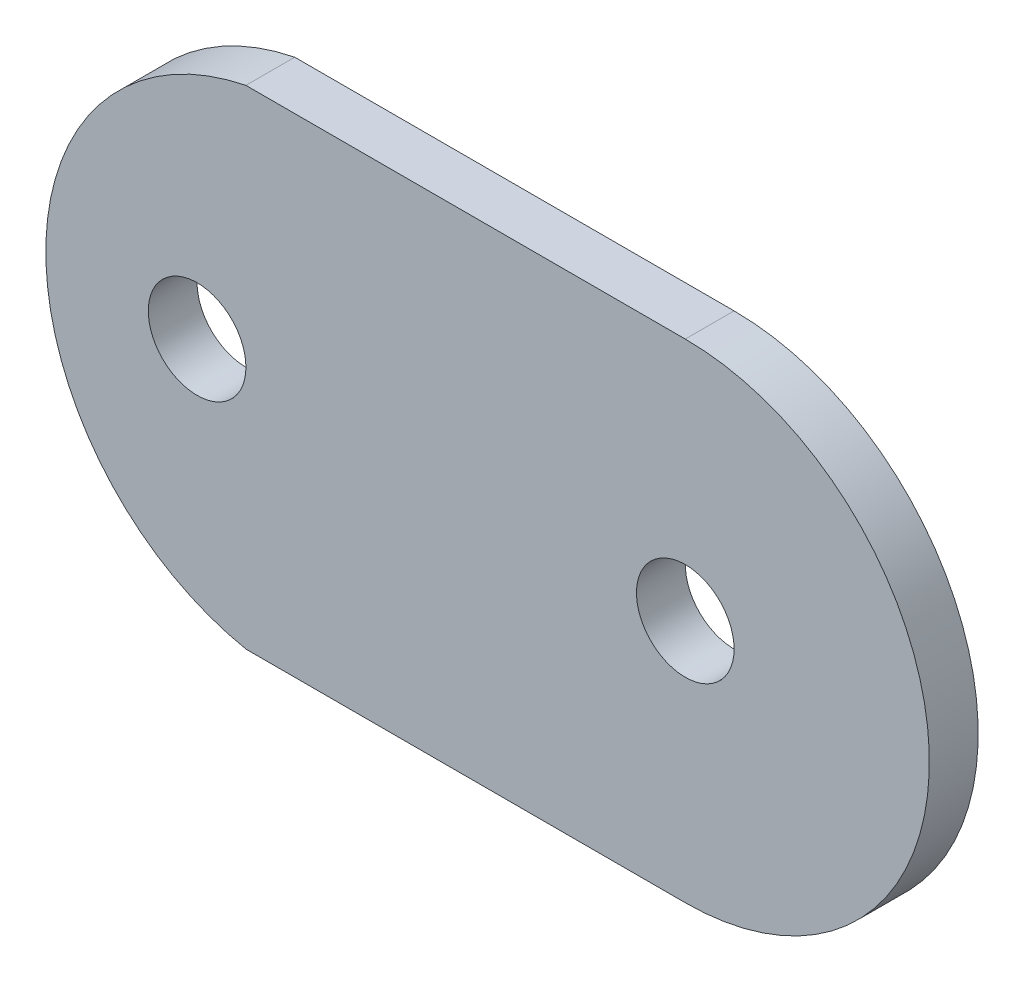
ISO-10303-21;
HEADER;
FILE_DESCRIPTION(('STEP AP214'),'2;1');
FILE_NAME('part.step','',(''),(''),'','','');
FILE_SCHEMA(('AUTOMOTIVE_DESIGN { 1 0 10303 214 1 1 1 1 }'));
ENDSEC;
DATA;
#1=APPLICATION_CONTEXT('core data for automotive mechanical design processes');
#2=APPLICATION_PROTOCOL_DEFINITION('international standard','automotive_design',2000,#1);
#3=PRODUCT_CONTEXT('',#1,'mechanical');
#4=PRODUCT('Part','Part','',(#3));
#5=PRODUCT_RELATED_PRODUCT_CATEGORY('part','',(#4));
#6=PRODUCT_DEFINITION_FORMATION('','',#4);
#7=PRODUCT_DEFINITION_CONTEXT('part definition',#1,'design');
#8=PRODUCT_DEFINITION('design','',#6,#7);
#9=PRODUCT_DEFINITION_SHAPE('','',#8);
#10=(LENGTH_UNIT() NAMED_UNIT(*) SI_UNIT(.MILLI.,.METRE.));
#11=(NAMED_UNIT(*) PLANE_ANGLE_UNIT() SI_UNIT($,.RADIAN.));
#12=(NAMED_UNIT(*) SI_UNIT($,.STERADIAN.) SOLID_ANGLE_UNIT());
#13=UNCERTAINTY_MEASURE_WITH_UNIT(LENGTH_MEASURE(1.E-05),#10,'distance_accuracy_value','');
#14=(GEOMETRIC_REPRESENTATION_CONTEXT(3) GLOBAL_UNCERTAINTY_ASSIGNED_CONTEXT((#13)) GLOBAL_UNIT_ASSIGNED_CONTEXT((#10,
#11,#12)) REPRESENTATION_CONTEXT('',''));
#15=CARTESIAN_POINT('',(0.,0.,0.));
#16=DIRECTION('',(0.,0.,1.));
#17=DIRECTION('',(1.,0.,0.));
#18=AXIS2_PLACEMENT_3D('',#15,#16,#17);
#19=CARTESIAN_POINT('',(5.,5.,1.));
#20=DIRECTION('',(0.,0.,-1.));
#21=DIRECTION('',(-1.,0.,0.));
#22=AXIS2_PLACEMENT_3D('',#19,#20,#21);
#23=PLANE('',#22);
#24=DIRECTION('',(1.,0.,0.));
#25=VECTOR('',#24,1.);
#26=CARTESIAN_POINT('',(-3.,0.,1.));
#27=LINE('',#26,#25);
#28=CARTESIAN_POINT('',(-4.,0.,1.));
#29=VERTEX_POINT('',#28);
#30=CARTESIAN_POINT('',(5.,0.,1.));
#31=VERTEX_POINT('',#30);
#32=EDGE_CURVE('E63',#29,#31,#27,.T.);
#33=ORIENTED_EDGE('',*,*,#32,.T.);
#34=CARTESIAN_POINT('',(5.,5.,1.));
#35=DIRECTION('',(0.,0.,1.));
#36=DIRECTION('',(-1.,0.,0.));
#37=AXIS2_PLACEMENT_3D('',#34,#35,#36);
#38=CIRCLE('',#37,5.);
#39=CARTESIAN_POINT('',(5.,10.,1.));
#40=VERTEX_POINT('',#39);
#41=EDGE_CURVE('E92',#31,#40,#38,.T.);
#42=ORIENTED_EDGE('',*,*,#41,.T.);
#43=DIRECTION('',(-1.,0.,0.));
#44=VECTOR('',#43,1.);
#45=CARTESIAN_POINT('',(0.,10.,1.));
#46=LINE('',#45,#44);
#47=CARTESIAN_POINT('',(-4.,10.,1.));
#48=VERTEX_POINT('',#47);
#49=EDGE_CURVE('E96',#40,#48,#46,.T.);
#50=ORIENTED_EDGE('',*,*,#49,.T.);
#51=CARTESIAN_POINT('',(-3.,5.,1.));
#52=DIRECTION('',(0.,0.,1.));
#53=DIRECTION('',(1.,0.,0.));
#54=AXIS2_PLACEMENT_3D('',#51,#52,#53);
#55=CIRCLE('',#54,5.09901951359279);
#56=EDGE_CURVE('E108',#48,#29,#55,.T.);
#57=ORIENTED_EDGE('',*,*,#56,.T.);
#58=EDGE_LOOP('',(#33,#42,#50,#57));
#59=FACE_BOUND('',#58,.T.);
#60=CARTESIAN_POINT('',(5.,5.,1.));
#61=DIRECTION('',(0.,0.,1.));
#62=DIRECTION('',(1.,0.,0.));
#63=AXIS2_PLACEMENT_3D('',#60,#61,#62);
#64=CIRCLE('',#63,1.);
#65=CARTESIAN_POINT('',(6.,5.,1.));
#66=VERTEX_POINT('',#65);
#67=EDGE_CURVE('E117',#66,#66,#64,.T.);
#68=ORIENTED_EDGE('',*,*,#67,.F.);
#69=EDGE_LOOP('',(#68));
#70=FACE_BOUND('',#69,.T.);
#71=CARTESIAN_POINT('',(-5.,5.,1.));
#72=DIRECTION('',(0.,0.,1.));
#73=DIRECTION('',(1.,0.,0.));
#74=AXIS2_PLACEMENT_3D('',#71,#72,#73);
#75=CIRCLE('',#74,1.);
#76=CARTESIAN_POINT('',(-4.,5.,1.));
#77=VERTEX_POINT('',#76);
#78=EDGE_CURVE('E160',#77,#77,#75,.T.);
#79=ORIENTED_EDGE('',*,*,#78,.F.);
#80=EDGE_LOOP('',(#79));
#81=FACE_BOUND('',#80,.T.);
#82=ADVANCED_FACE('F45',(#59,#70,#81),#23,.F.);
#83=CARTESIAN_POINT('',(5.,5.,0.));
#84=DIRECTION('',(0.,0.,-1.));
#85=DIRECTION('',(-1.,0.,0.));
#86=AXIS2_PLACEMENT_3D('',#83,#84,#85);
#87=PLANE('',#86);
#88=CARTESIAN_POINT('',(5.,5.,0.));
#89=DIRECTION('',(0.,0.,1.));
#90=DIRECTION('',(1.,0.,0.));
#91=AXIS2_PLACEMENT_3D('',#88,#89,#90);
#92=CIRCLE('',#91,1.);
#93=CARTESIAN_POINT('',(6.,5.,0.));
#94=VERTEX_POINT('',#93);
#95=EDGE_CURVE('E167',#94,#94,#92,.T.);
#96=ORIENTED_EDGE('',*,*,#95,.T.);
#97=EDGE_LOOP('',(#96));
#98=FACE_BOUND('',#97,.T.);
#99=CARTESIAN_POINT('',(5.,5.,0.));
#100=DIRECTION('',(0.,0.,1.));
#101=DIRECTION('',(-1.,0.,0.));
#102=AXIS2_PLACEMENT_3D('',#99,#100,#101);
#103=CIRCLE('',#102,5.);
#104=CARTESIAN_POINT('',(5.,0.,0.));
#105=VERTEX_POINT('',#104);
#106=CARTESIAN_POINT('',(5.,10.,0.));
#107=VERTEX_POINT('',#106);
#108=EDGE_CURVE('E102',#105,#107,#103,.T.);
#109=ORIENTED_EDGE('',*,*,#108,.F.);
#110=DIRECTION('',(1.,0.,0.));
#111=VECTOR('',#110,1.);
#112=CARTESIAN_POINT('',(-3.,0.,0.));
#113=LINE('',#112,#111);
#114=CARTESIAN_POINT('',(-4.,0.,0.));
#115=VERTEX_POINT('',#114);
#116=EDGE_CURVE('E122',#115,#105,#113,.T.);
#117=ORIENTED_EDGE('',*,*,#116,.F.);
#118=CARTESIAN_POINT('',(-3.,5.,0.));
#119=DIRECTION('',(0.,0.,1.));
#120=DIRECTION('',(1.,0.,0.));
#121=AXIS2_PLACEMENT_3D('',#118,#119,#120);
#122=CIRCLE('',#121,5.09901951359279);
#123=CARTESIAN_POINT('',(-4.,10.,0.));
#124=VERTEX_POINT('',#123);
#125=EDGE_CURVE('E87',#124,#115,#122,.T.);
#126=ORIENTED_EDGE('',*,*,#125,.F.);
#127=DIRECTION('',(-1.,0.,0.));
#128=VECTOR('',#127,1.);
#129=CARTESIAN_POINT('',(-3.,10.,0.));
#130=LINE('',#129,#128);
#131=EDGE_CURVE('E80',#107,#124,#130,.T.);
#132=ORIENTED_EDGE('',*,*,#131,.F.);
#133=EDGE_LOOP('',(#109,#117,#126,#132));
#134=FACE_BOUND('',#133,.T.);
#135=CARTESIAN_POINT('',(-5.,5.,0.));
#136=DIRECTION('',(0.,0.,1.));
#137=DIRECTION('',(1.,0.,0.));
#138=AXIS2_PLACEMENT_3D('',#135,#136,#137);
#139=CIRCLE('',#138,1.);
#140=CARTESIAN_POINT('',(-4.,5.,0.));
#141=VERTEX_POINT('',#140);
#142=EDGE_CURVE('E163',#141,#141,#139,.T.);
#143=ORIENTED_EDGE('',*,*,#142,.T.);
#144=EDGE_LOOP('',(#143));
#145=FACE_BOUND('',#144,.T.);
#146=ADVANCED_FACE('F131',(#98,#134,#145),#87,.T.);
#147=CARTESIAN_POINT('',(5.,5.,1.));
#148=DIRECTION('',(0.,0.,-1.));
#149=DIRECTION('',(-1.,0.,0.));
#150=AXIS2_PLACEMENT_3D('',#147,#148,#149);
#151=CYLINDRICAL_SURFACE('',#150,5.);
#152=ORIENTED_EDGE('',*,*,#108,.T.);
#153=DIRECTION('',(0.,0.,-1.));
#154=VECTOR('',#153,1.);
#155=CARTESIAN_POINT('',(5.,10.,1.));
#156=LINE('',#155,#154);
#157=EDGE_CURVE('E55',#40,#107,#156,.T.);
#158=ORIENTED_EDGE('',*,*,#157,.F.);
#159=ORIENTED_EDGE('',*,*,#41,.F.);
#160=DIRECTION('',(0.,0.,-1.));
#161=VECTOR('',#160,1.);
#162=CARTESIAN_POINT('',(5.,0.,1.));
#163=LINE('',#162,#161);
#164=EDGE_CURVE('E11',#31,#105,#163,.T.);
#165=ORIENTED_EDGE('',*,*,#164,.T.);
#166=EDGE_LOOP('',(#152,#158,#159,#165));
#167=FACE_BOUND('',#166,.T.);
#168=ADVANCED_FACE('F47',(#167),#151,.T.);
#169=CARTESIAN_POINT('',(-3.,10.,1.));
#170=DIRECTION('',(0.,-1.,0.));
#171=DIRECTION('',(0.,0.,-1.));
#172=AXIS2_PLACEMENT_3D('',#169,#170,#171);
#173=PLANE('',#172);
#174=ORIENTED_EDGE('',*,*,#131,.T.);
#175=DIRECTION('',(0.,0.,-1.));
#176=VECTOR('',#175,1.);
#177=CARTESIAN_POINT('',(-4.,10.,1.));
#178=LINE('',#177,#176);
#179=EDGE_CURVE('E104',#48,#124,#178,.T.);
#180=ORIENTED_EDGE('',*,*,#179,.F.);
#181=ORIENTED_EDGE('',*,*,#49,.F.);
#182=ORIENTED_EDGE('',*,*,#157,.T.);
#183=EDGE_LOOP('',(#174,#180,#181,#182));
#184=FACE_BOUND('',#183,.T.);
#185=ADVANCED_FACE('F105',(#184),#173,.F.);
#186=CARTESIAN_POINT('',(-3.,5.,1.));
#187=DIRECTION('',(0.,0.,-1.));
#188=DIRECTION('',(-1.,0.,0.));
#189=AXIS2_PLACEMENT_3D('',#186,#187,#188);
#190=CYLINDRICAL_SURFACE('',#189,5.09901951359279);
#191=ORIENTED_EDGE('',*,*,#125,.T.);
#192=DIRECTION('',(0.,0.,-1.));
#193=VECTOR('',#192,1.);
#194=CARTESIAN_POINT('',(-4.,0.,1.));
#195=LINE('',#194,#193);
#196=EDGE_CURVE('E111',#29,#115,#195,.T.);
#197=ORIENTED_EDGE('',*,*,#196,.F.);
#198=ORIENTED_EDGE('',*,*,#56,.F.);
#199=ORIENTED_EDGE('',*,*,#179,.T.);
#200=EDGE_LOOP('',(#191,#197,#198,#199));
#201=FACE_BOUND('',#200,.T.);
#202=ADVANCED_FACE('F128',(#201),#190,.T.);
#203=CARTESIAN_POINT('',(-3.,0.,1.));
#204=DIRECTION('',(0.,1.,0.));
#205=DIRECTION('',(-1.,0.,0.));
#206=AXIS2_PLACEMENT_3D('',#203,#204,#205);
#207=PLANE('',#206);
#208=ORIENTED_EDGE('',*,*,#116,.T.);
#209=ORIENTED_EDGE('',*,*,#164,.F.);
#210=ORIENTED_EDGE('',*,*,#32,.F.);
#211=ORIENTED_EDGE('',*,*,#196,.T.);
#212=EDGE_LOOP('',(#208,#209,#210,#211));
#213=FACE_BOUND('',#212,.T.);
#214=ADVANCED_FACE('F133',(#213),#207,.F.);
#215=CARTESIAN_POINT('',(5.,5.,1.));
#216=DIRECTION('',(0.,0.,-1.));
#217=DIRECTION('',(-1.,0.,0.));
#218=AXIS2_PLACEMENT_3D('',#215,#216,#217);
#219=CYLINDRICAL_SURFACE('',#218,1.);
#220=ORIENTED_EDGE('',*,*,#67,.T.);
#221=EDGE_LOOP('',(#220));
#222=FACE_BOUND('',#221,.T.);
#223=ORIENTED_EDGE('',*,*,#95,.F.);
#224=EDGE_LOOP('',(#223));
#225=FACE_BOUND('',#224,.T.);
#226=ADVANCED_FACE('F135',(#222,#225),#219,.F.);
#227=CARTESIAN_POINT('',(-5.,5.,1.));
#228=DIRECTION('',(0.,0.,-1.));
#229=DIRECTION('',(-1.,0.,0.));
#230=AXIS2_PLACEMENT_3D('',#227,#228,#229);
#231=CYLINDRICAL_SURFACE('',#230,1.);
#232=ORIENTED_EDGE('',*,*,#78,.T.);
#233=EDGE_LOOP('',(#232));
#234=FACE_BOUND('',#233,.T.);
#235=ORIENTED_EDGE('',*,*,#142,.F.);
#236=EDGE_LOOP('',(#235));
#237=FACE_BOUND('',#236,.T.);
#238=ADVANCED_FACE('F141',(#234,#237),#231,.F.);
#239=CLOSED_SHELL('',(#82,#146,#168,#185,#202,#214,#226,#238));
#240=MANIFOLD_SOLID_BREP('B2',#239);
#241=ADVANCED_BREP_SHAPE_REPRESENTATION('',(#18,#240),#14);
#242=SHAPE_DEFINITION_REPRESENTATION(#9,#241);
ENDSEC;
END-ISO-10303-21;
